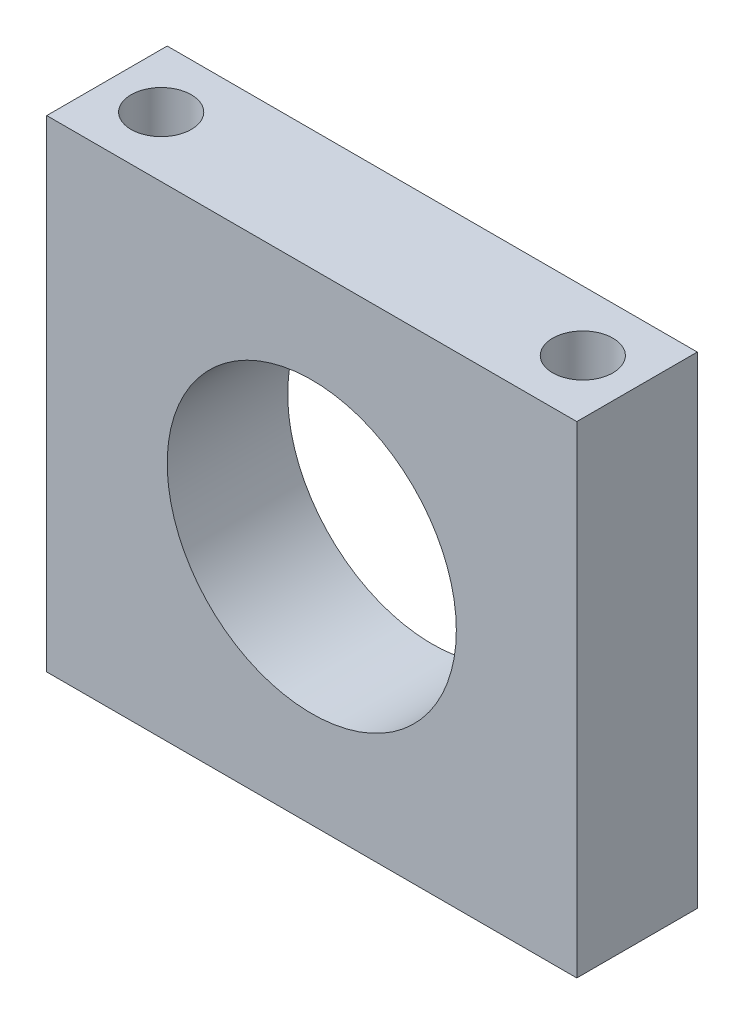
ISO-10303-21;
HEADER;
FILE_DESCRIPTION(('STEP AP214'),'2;1');
FILE_NAME('part.step','',(''),(''),'','','');
FILE_SCHEMA(('AUTOMOTIVE_DESIGN { 1 0 10303 214 1 1 1 1 }'));
ENDSEC;
DATA;
#1=APPLICATION_CONTEXT('core data for automotive mechanical design processes');
#2=APPLICATION_PROTOCOL_DEFINITION('international standard','automotive_design',2000,#1);
#3=PRODUCT_CONTEXT('',#1,'mechanical');
#4=PRODUCT('Part','Part','',(#3));
#5=PRODUCT_RELATED_PRODUCT_CATEGORY('part','',(#4));
#6=PRODUCT_DEFINITION_FORMATION('','',#4);
#7=PRODUCT_DEFINITION_CONTEXT('part definition',#1,'design');
#8=PRODUCT_DEFINITION('design','',#6,#7);
#9=PRODUCT_DEFINITION_SHAPE('','',#8);
#10=(LENGTH_UNIT() NAMED_UNIT(*) SI_UNIT(.MILLI.,.METRE.));
#11=(NAMED_UNIT(*) PLANE_ANGLE_UNIT() SI_UNIT($,.RADIAN.));
#12=(NAMED_UNIT(*) SI_UNIT($,.STERADIAN.) SOLID_ANGLE_UNIT());
#13=UNCERTAINTY_MEASURE_WITH_UNIT(LENGTH_MEASURE(1.E-05),#10,'distance_accuracy_value','');
#14=(GEOMETRIC_REPRESENTATION_CONTEXT(3) GLOBAL_UNCERTAINTY_ASSIGNED_CONTEXT((#13)) GLOBAL_UNIT_ASSIGNED_CONTEXT((#10,
#11,#12)) REPRESENTATION_CONTEXT('',''));
#15=CARTESIAN_POINT('',(0.,0.,0.));
#16=DIRECTION('',(0.,0.,1.));
#17=DIRECTION('',(1.,0.,0.));
#18=AXIS2_PLACEMENT_3D('',#15,#16,#17);
#19=CARTESIAN_POINT('',(0.,0.,5.));
#20=DIRECTION('',(0.,1.,0.));
#21=DIRECTION('',(0.,0.,1.));
#22=AXIS2_PLACEMENT_3D('',#19,#20,#21);
#23=PLANE('',#22);
#24=DIRECTION('',(1.,0.,0.));
#25=VECTOR('',#24,1.);
#26=CARTESIAN_POINT('',(0.,0.,0.));
#27=LINE('',#26,#25);
#28=CARTESIAN_POINT('',(0.,0.,0.));
#29=VERTEX_POINT('',#28);
#30=CARTESIAN_POINT('',(22.,0.,0.));
#31=VERTEX_POINT('',#30);
#32=EDGE_CURVE('E105',#29,#31,#27,.T.);
#33=ORIENTED_EDGE('',*,*,#32,.T.);
#34=DIRECTION('',(0.,0.,-1.));
#35=VECTOR('',#34,1.);
#36=CARTESIAN_POINT('',(22.,0.,5.));
#37=LINE('',#36,#35);
#38=CARTESIAN_POINT('',(22.,0.,5.));
#39=VERTEX_POINT('',#38);
#40=EDGE_CURVE('E11',#39,#31,#37,.T.);
#41=ORIENTED_EDGE('',*,*,#40,.F.);
#42=DIRECTION('',(1.,0.,0.));
#43=VECTOR('',#42,1.);
#44=CARTESIAN_POINT('',(0.,0.,5.));
#45=LINE('',#44,#43);
#46=CARTESIAN_POINT('',(0.,0.,5.));
#47=VERTEX_POINT('',#46);
#48=EDGE_CURVE('E87',#47,#39,#45,.T.);
#49=ORIENTED_EDGE('',*,*,#48,.F.);
#50=DIRECTION('',(0.,0.,-1.));
#51=VECTOR('',#50,1.);
#52=CARTESIAN_POINT('',(0.,0.,5.));
#53=LINE('',#52,#51);
#54=EDGE_CURVE('E53',#47,#29,#53,.T.);
#55=ORIENTED_EDGE('',*,*,#54,.T.);
#56=EDGE_LOOP('',(#33,#41,#49,#55));
#57=FACE_BOUND('',#56,.T.);
#58=CARTESIAN_POINT('',(2.25,0.,2.5));
#59=DIRECTION('',(0.,1.,0.));
#60=DIRECTION('',(0.,0.,1.));
#61=AXIS2_PLACEMENT_3D('',#58,#59,#60);
#62=CIRCLE('',#61,1.25);
#63=CARTESIAN_POINT('',(2.25,0.,3.75));
#64=VERTEX_POINT('',#63);
#65=EDGE_CURVE('E107',#64,#64,#62,.T.);
#66=ORIENTED_EDGE('',*,*,#65,.T.);
#67=EDGE_LOOP('',(#66));
#68=FACE_BOUND('',#67,.T.);
#69=CARTESIAN_POINT('',(19.75,0.,2.5));
#70=DIRECTION('',(0.,-1.,0.));
#71=DIRECTION('',(0.,0.,-1.));
#72=AXIS2_PLACEMENT_3D('',#69,#70,#71);
#73=CIRCLE('',#72,1.25);
#74=CARTESIAN_POINT('',(19.75,0.,1.25));
#75=VERTEX_POINT('',#74);
#76=EDGE_CURVE('E127',#75,#75,#73,.T.);
#77=ORIENTED_EDGE('',*,*,#76,.F.);
#78=EDGE_LOOP('',(#77));
#79=FACE_BOUND('',#78,.T.);
#80=ADVANCED_FACE('F37',(#57,#68,#79),#23,.F.);
#81=CARTESIAN_POINT('',(0.,20.,5.));
#82=DIRECTION('',(0.,1.,0.));
#83=DIRECTION('',(0.,0.,1.));
#84=AXIS2_PLACEMENT_3D('',#81,#82,#83);
#85=PLANE('',#84);
#86=DIRECTION('',(1.,0.,0.));
#87=VECTOR('',#86,1.);
#88=CARTESIAN_POINT('',(0.,20.,0.));
#89=LINE('',#88,#87);
#90=CARTESIAN_POINT('',(0.,20.,0.));
#91=VERTEX_POINT('',#90);
#92=CARTESIAN_POINT('',(22.,20.,0.));
#93=VERTEX_POINT('',#92);
#94=EDGE_CURVE('E109',#91,#93,#89,.T.);
#95=ORIENTED_EDGE('',*,*,#94,.F.);
#96=DIRECTION('',(0.,0.,-1.));
#97=VECTOR('',#96,1.);
#98=CARTESIAN_POINT('',(0.,20.,5.));
#99=LINE('',#98,#97);
#100=CARTESIAN_POINT('',(0.,20.,5.));
#101=VERTEX_POINT('',#100);
#102=EDGE_CURVE('E67',#101,#91,#99,.T.);
#103=ORIENTED_EDGE('',*,*,#102,.F.);
#104=DIRECTION('',(1.,0.,0.));
#105=VECTOR('',#104,1.);
#106=CARTESIAN_POINT('',(0.,20.,5.));
#107=LINE('',#106,#105);
#108=CARTESIAN_POINT('',(22.,20.,5.));
#109=VERTEX_POINT('',#108);
#110=EDGE_CURVE('E86',#101,#109,#107,.T.);
#111=ORIENTED_EDGE('',*,*,#110,.T.);
#112=DIRECTION('',(0.,0.,-1.));
#113=VECTOR('',#112,1.);
#114=CARTESIAN_POINT('',(22.,20.,5.));
#115=LINE('',#114,#113);
#116=EDGE_CURVE('E45',#109,#93,#115,.T.);
#117=ORIENTED_EDGE('',*,*,#116,.T.);
#118=EDGE_LOOP('',(#95,#103,#111,#117));
#119=FACE_BOUND('',#118,.T.);
#120=CARTESIAN_POINT('',(2.25,20.,2.5));
#121=DIRECTION('',(0.,1.,0.));
#122=DIRECTION('',(0.,0.,1.));
#123=AXIS2_PLACEMENT_3D('',#120,#121,#122);
#124=CIRCLE('',#123,1.25);
#125=CARTESIAN_POINT('',(2.25,20.,3.75));
#126=VERTEX_POINT('',#125);
#127=EDGE_CURVE('E121',#126,#126,#124,.T.);
#128=ORIENTED_EDGE('',*,*,#127,.F.);
#129=EDGE_LOOP('',(#128));
#130=FACE_BOUND('',#129,.T.);
#131=CARTESIAN_POINT('',(19.75,20.,2.5));
#132=DIRECTION('',(0.,-1.,0.));
#133=DIRECTION('',(0.,0.,-1.));
#134=AXIS2_PLACEMENT_3D('',#131,#132,#133);
#135=CIRCLE('',#134,1.25);
#136=CARTESIAN_POINT('',(19.75,20.,1.25));
#137=VERTEX_POINT('',#136);
#138=EDGE_CURVE('E124',#137,#137,#135,.T.);
#139=ORIENTED_EDGE('',*,*,#138,.T.);
#140=EDGE_LOOP('',(#139));
#141=FACE_BOUND('',#140,.T.);
#142=ADVANCED_FACE('F95',(#119,#130,#141),#85,.T.);
#143=CARTESIAN_POINT('',(22.,0.,5.));
#144=DIRECTION('',(-1.,0.,0.));
#145=DIRECTION('',(0.,0.,1.));
#146=AXIS2_PLACEMENT_3D('',#143,#144,#145);
#147=PLANE('',#146);
#148=DIRECTION('',(0.,1.,0.));
#149=VECTOR('',#148,1.);
#150=CARTESIAN_POINT('',(22.,0.,0.));
#151=LINE('',#150,#149);
#152=EDGE_CURVE('E92',#31,#93,#151,.T.);
#153=ORIENTED_EDGE('',*,*,#152,.T.);
#154=ORIENTED_EDGE('',*,*,#116,.F.);
#155=DIRECTION('',(0.,1.,0.));
#156=VECTOR('',#155,1.);
#157=CARTESIAN_POINT('',(22.,0.,5.));
#158=LINE('',#157,#156);
#159=EDGE_CURVE('E78',#39,#109,#158,.T.);
#160=ORIENTED_EDGE('',*,*,#159,.F.);
#161=ORIENTED_EDGE('',*,*,#40,.T.);
#162=EDGE_LOOP('',(#153,#154,#160,#161));
#163=FACE_BOUND('',#162,.T.);
#164=ADVANCED_FACE('F91',(#163),#147,.F.);
#165=CARTESIAN_POINT('',(0.,0.,5.));
#166=DIRECTION('',(-1.,0.,0.));
#167=DIRECTION('',(0.,0.,1.));
#168=AXIS2_PLACEMENT_3D('',#165,#166,#167);
#169=PLANE('',#168);
#170=DIRECTION('',(0.,1.,0.));
#171=VECTOR('',#170,1.);
#172=CARTESIAN_POINT('',(0.,0.,0.));
#173=LINE('',#172,#171);
#174=EDGE_CURVE('E111',#29,#91,#173,.T.);
#175=ORIENTED_EDGE('',*,*,#174,.F.);
#176=ORIENTED_EDGE('',*,*,#54,.F.);
#177=DIRECTION('',(0.,1.,0.));
#178=VECTOR('',#177,1.);
#179=CARTESIAN_POINT('',(0.,0.,5.));
#180=LINE('',#179,#178);
#181=EDGE_CURVE('E97',#47,#101,#180,.T.);
#182=ORIENTED_EDGE('',*,*,#181,.T.);
#183=ORIENTED_EDGE('',*,*,#102,.T.);
#184=EDGE_LOOP('',(#175,#176,#182,#183));
#185=FACE_BOUND('',#184,.T.);
#186=ADVANCED_FACE('F157',(#185),#169,.T.);
#187=CARTESIAN_POINT('',(11.,10.,5.));
#188=DIRECTION('',(0.,0.,-1.));
#189=DIRECTION('',(-1.,0.,0.));
#190=AXIS2_PLACEMENT_3D('',#187,#188,#189);
#191=CYLINDRICAL_SURFACE('',#190,6.);
#192=CARTESIAN_POINT('',(11.,10.,5.));
#193=DIRECTION('',(0.,0.,1.));
#194=DIRECTION('',(1.,0.,0.));
#195=AXIS2_PLACEMENT_3D('',#192,#193,#194);
#196=CIRCLE('',#195,6.);
#197=CARTESIAN_POINT('',(17.,10.,5.));
#198=VERTEX_POINT('',#197);
#199=EDGE_CURVE('E99',#198,#198,#196,.T.);
#200=ORIENTED_EDGE('',*,*,#199,.T.);
#201=EDGE_LOOP('',(#200));
#202=FACE_BOUND('',#201,.T.);
#203=CARTESIAN_POINT('',(11.,10.,0.));
#204=DIRECTION('',(0.,0.,1.));
#205=DIRECTION('',(1.,0.,0.));
#206=AXIS2_PLACEMENT_3D('',#203,#204,#205);
#207=CIRCLE('',#206,6.);
#208=CARTESIAN_POINT('',(17.,10.,0.));
#209=VERTEX_POINT('',#208);
#210=EDGE_CURVE('E114',#209,#209,#207,.T.);
#211=ORIENTED_EDGE('',*,*,#210,.F.);
#212=EDGE_LOOP('',(#211));
#213=FACE_BOUND('',#212,.T.);
#214=ADVANCED_FACE('F159',(#202,#213),#191,.F.);
#215=CARTESIAN_POINT('',(0.,0.,5.));
#216=DIRECTION('',(0.,0.,1.));
#217=DIRECTION('',(1.,0.,0.));
#218=AXIS2_PLACEMENT_3D('',#215,#216,#217);
#219=PLANE('',#218);
#220=ORIENTED_EDGE('',*,*,#48,.T.);
#221=ORIENTED_EDGE('',*,*,#159,.T.);
#222=ORIENTED_EDGE('',*,*,#110,.F.);
#223=ORIENTED_EDGE('',*,*,#181,.F.);
#224=EDGE_LOOP('',(#220,#221,#222,#223));
#225=FACE_BOUND('',#224,.T.);
#226=ORIENTED_EDGE('',*,*,#199,.F.);
#227=EDGE_LOOP('',(#226));
#228=FACE_BOUND('',#227,.T.);
#229=ADVANCED_FACE('F82',(#225,#228),#219,.T.);
#230=CARTESIAN_POINT('',(0.,0.,0.));
#231=DIRECTION('',(0.,0.,1.));
#232=DIRECTION('',(1.,0.,0.));
#233=AXIS2_PLACEMENT_3D('',#230,#231,#232);
#234=PLANE('',#233);
#235=ORIENTED_EDGE('',*,*,#32,.F.);
#236=ORIENTED_EDGE('',*,*,#174,.T.);
#237=ORIENTED_EDGE('',*,*,#94,.T.);
#238=ORIENTED_EDGE('',*,*,#152,.F.);
#239=EDGE_LOOP('',(#235,#236,#237,#238));
#240=FACE_BOUND('',#239,.T.);
#241=ORIENTED_EDGE('',*,*,#210,.T.);
#242=EDGE_LOOP('',(#241));
#243=FACE_BOUND('',#242,.T.);
#244=ADVANCED_FACE('F142',(#240,#243),#234,.F.);
#245=CARTESIAN_POINT('',(2.25,0.,2.5));
#246=DIRECTION('',(0.,1.,0.));
#247=DIRECTION('',(0.,0.,1.));
#248=AXIS2_PLACEMENT_3D('',#245,#246,#247);
#249=CYLINDRICAL_SURFACE('',#248,1.25);
#250=ORIENTED_EDGE('',*,*,#65,.F.);
#251=EDGE_LOOP('',(#250));
#252=FACE_BOUND('',#251,.T.);
#253=ORIENTED_EDGE('',*,*,#127,.T.);
#254=EDGE_LOOP('',(#253));
#255=FACE_BOUND('',#254,.T.);
#256=ADVANCED_FACE('F136',(#252,#255),#249,.F.);
#257=CARTESIAN_POINT('',(19.75,0.,2.5));
#258=DIRECTION('',(0.,1.,0.));
#259=DIRECTION('',(0.,0.,1.));
#260=AXIS2_PLACEMENT_3D('',#257,#258,#259);
#261=CYLINDRICAL_SURFACE('',#260,1.25);
#262=ORIENTED_EDGE('',*,*,#76,.T.);
#263=EDGE_LOOP('',(#262));
#264=FACE_BOUND('',#263,.T.);
#265=ORIENTED_EDGE('',*,*,#138,.F.);
#266=EDGE_LOOP('',(#265));
#267=FACE_BOUND('',#266,.T.);
#268=ADVANCED_FACE('F134',(#264,#267),#261,.F.);
#269=CLOSED_SHELL('',(#80,#142,#164,#186,#214,#229,#244,#256,#268));
#270=MANIFOLD_SOLID_BREP('B2',#269);
#271=ADVANCED_BREP_SHAPE_REPRESENTATION('',(#18,#270),#14);
#272=SHAPE_DEFINITION_REPRESENTATION(#9,#271);
ENDSEC;
END-ISO-10303-21;
